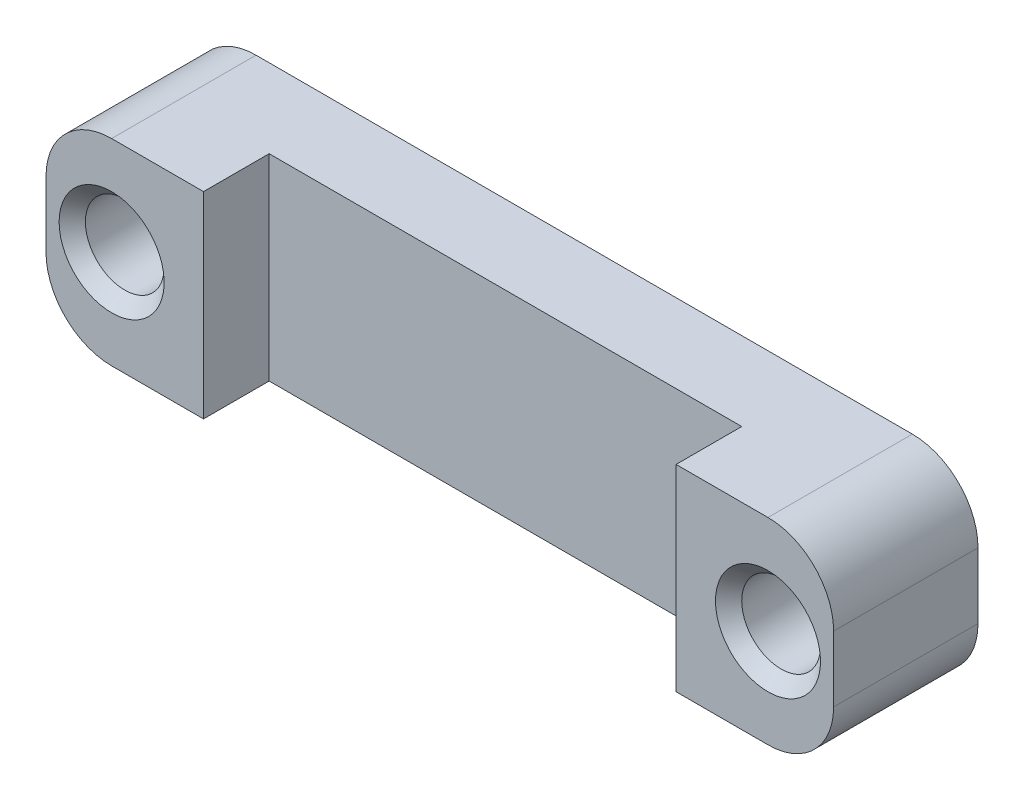
ISO-10303-21;
HEADER;
FILE_DESCRIPTION(('STEP AP214'),'2;1');
FILE_NAME('part.step','',(''),(''),'','','');
FILE_SCHEMA(('AUTOMOTIVE_DESIGN { 1 0 10303 214 1 1 1 1 }'));
ENDSEC;
DATA;
#1=APPLICATION_CONTEXT('core data for automotive mechanical design processes');
#2=APPLICATION_PROTOCOL_DEFINITION('international standard','automotive_design',2000,#1);
#3=PRODUCT_CONTEXT('',#1,'mechanical');
#4=PRODUCT('Part','Part','',(#3));
#5=PRODUCT_RELATED_PRODUCT_CATEGORY('part','',(#4));
#6=PRODUCT_DEFINITION_FORMATION('','',#4);
#7=PRODUCT_DEFINITION_CONTEXT('part definition',#1,'design');
#8=PRODUCT_DEFINITION('design','',#6,#7);
#9=PRODUCT_DEFINITION_SHAPE('','',#8);
#10=(LENGTH_UNIT() NAMED_UNIT(*) SI_UNIT(.MILLI.,.METRE.));
#11=(NAMED_UNIT(*) PLANE_ANGLE_UNIT() SI_UNIT($,.RADIAN.));
#12=(NAMED_UNIT(*) SI_UNIT($,.STERADIAN.) SOLID_ANGLE_UNIT());
#13=UNCERTAINTY_MEASURE_WITH_UNIT(LENGTH_MEASURE(1.E-05),#10,'distance_accuracy_value','');
#14=(GEOMETRIC_REPRESENTATION_CONTEXT(3) GLOBAL_UNCERTAINTY_ASSIGNED_CONTEXT((#13)) GLOBAL_UNIT_ASSIGNED_CONTEXT((#10,
#11,#12)) REPRESENTATION_CONTEXT('',''));
#15=CARTESIAN_POINT('',(0.,0.,0.));
#16=DIRECTION('',(0.,0.,1.));
#17=DIRECTION('',(1.,0.,0.));
#18=AXIS2_PLACEMENT_3D('',#15,#16,#17);
#19=CARTESIAN_POINT('',(0.,0.,11.));
#20=DIRECTION('',(0.,0.,-1.));
#21=DIRECTION('',(-1.,0.,0.));
#22=AXIS2_PLACEMENT_3D('',#19,#20,#21);
#23=PLANE('',#22);
#24=CARTESIAN_POINT('',(5.,7.5,11.));
#25=DIRECTION('',(0.,0.,-1.));
#26=DIRECTION('',(-1.,0.,0.));
#27=AXIS2_PLACEMENT_3D('',#24,#25,#26);
#28=CIRCLE('',#27,4.);
#29=CARTESIAN_POINT('',(1.,7.5,11.));
#30=VERTEX_POINT('',#29);
#31=EDGE_CURVE('E11',#30,#30,#28,.T.);
#32=ORIENTED_EDGE('',*,*,#31,.T.);
#33=EDGE_LOOP('',(#32));
#34=FACE_BOUND('',#33,.T.);
#35=DIRECTION('',(1.,0.,0.));
#36=VECTOR('',#35,1.);
#37=CARTESIAN_POINT('',(60.,0.,11.));
#38=LINE('',#37,#36);
#39=CARTESIAN_POINT('',(5.,0.,11.));
#40=VERTEX_POINT('',#39);
#41=CARTESIAN_POINT('',(12.,0.,11.));
#42=VERTEX_POINT('',#41);
#43=EDGE_CURVE('E163',#40,#42,#38,.T.);
#44=ORIENTED_EDGE('',*,*,#43,.T.);
#45=DIRECTION('',(0.,1.,0.));
#46=VECTOR('',#45,1.);
#47=CARTESIAN_POINT('',(12.,-6.00000000000001,11.));
#48=LINE('',#47,#46);
#49=CARTESIAN_POINT('',(12.,15.,11.));
#50=VERTEX_POINT('',#49);
#51=EDGE_CURVE('E146',#42,#50,#48,.T.);
#52=ORIENTED_EDGE('',*,*,#51,.T.);
#53=DIRECTION('',(-1.,0.,0.));
#54=VECTOR('',#53,1.);
#55=CARTESIAN_POINT('',(0.,15.,11.));
#56=LINE('',#55,#54);
#57=CARTESIAN_POINT('',(5.,15.,11.));
#58=VERTEX_POINT('',#57);
#59=EDGE_CURVE('E56',#50,#58,#56,.T.);
#60=ORIENTED_EDGE('',*,*,#59,.T.);
#61=CARTESIAN_POINT('',(5.,10.,11.));
#62=DIRECTION('',(0.,0.,-1.));
#63=DIRECTION('',(-1.,0.,0.));
#64=AXIS2_PLACEMENT_3D('',#61,#62,#63);
#65=CIRCLE('',#64,5.);
#66=CARTESIAN_POINT('',(0.,10.,11.));
#67=VERTEX_POINT('',#66);
#68=EDGE_CURVE('E205',#58,#67,#65,.F.);
#69=ORIENTED_EDGE('',*,*,#68,.T.);
#70=DIRECTION('',(0.,-1.,0.));
#71=VECTOR('',#70,1.);
#72=CARTESIAN_POINT('',(0.,0.,11.));
#73=LINE('',#72,#71);
#74=CARTESIAN_POINT('',(0.,5.,11.));
#75=VERTEX_POINT('',#74);
#76=EDGE_CURVE('E172',#67,#75,#73,.T.);
#77=ORIENTED_EDGE('',*,*,#76,.T.);
#78=CARTESIAN_POINT('',(5.,5.,11.));
#79=DIRECTION('',(0.,0.,-1.));
#80=DIRECTION('',(-1.,0.,0.));
#81=AXIS2_PLACEMENT_3D('',#78,#79,#80);
#82=CIRCLE('',#81,5.);
#83=EDGE_CURVE('E211',#75,#40,#82,.F.);
#84=ORIENTED_EDGE('',*,*,#83,.T.);
#85=EDGE_LOOP('',(#44,#52,#60,#69,#77,#84));
#86=FACE_BOUND('',#85,.T.);
#87=ADVANCED_FACE('F33',(#34,#86),#23,.F.);
#88=CARTESIAN_POINT('',(55.,7.5,11.));
#89=DIRECTION('',(0.,0.,-1.));
#90=DIRECTION('',(-1.,0.,0.));
#91=AXIS2_PLACEMENT_3D('',#88,#89,#90);
#92=CIRCLE('',#91,4.);
#93=CARTESIAN_POINT('',(51.,7.5,11.));
#94=VERTEX_POINT('',#93);
#95=EDGE_CURVE('E226',#94,#94,#92,.T.);
#96=ORIENTED_EDGE('',*,*,#95,.T.);
#97=EDGE_LOOP('',(#96));
#98=FACE_BOUND('',#97,.T.);
#99=CARTESIAN_POINT('',(55.,15.,11.));
#100=VERTEX_POINT('',#99);
#101=CARTESIAN_POINT('',(48.,15.,11.));
#102=VERTEX_POINT('',#101);
#103=EDGE_CURVE('E170',#100,#102,#56,.T.);
#104=ORIENTED_EDGE('',*,*,#103,.T.);
#105=DIRECTION('',(0.,1.,0.));
#106=VECTOR('',#105,1.);
#107=CARTESIAN_POINT('',(48.,-6.00000000000001,11.));
#108=LINE('',#107,#106);
#109=CARTESIAN_POINT('',(48.,0.,11.));
#110=VERTEX_POINT('',#109);
#111=EDGE_CURVE('E48',#110,#102,#108,.T.);
#112=ORIENTED_EDGE('',*,*,#111,.F.);
#113=CARTESIAN_POINT('',(55.,0.,11.));
#114=VERTEX_POINT('',#113);
#115=EDGE_CURVE('E167',#110,#114,#38,.T.);
#116=ORIENTED_EDGE('',*,*,#115,.T.);
#117=CARTESIAN_POINT('',(55.,5.,11.));
#118=DIRECTION('',(0.,0.,-1.));
#119=DIRECTION('',(-1.,0.,0.));
#120=AXIS2_PLACEMENT_3D('',#117,#118,#119);
#121=CIRCLE('',#120,5.);
#122=CARTESIAN_POINT('',(60.,5.,11.));
#123=VERTEX_POINT('',#122);
#124=EDGE_CURVE('E209',#114,#123,#121,.F.);
#125=ORIENTED_EDGE('',*,*,#124,.T.);
#126=DIRECTION('',(0.,1.,0.));
#127=VECTOR('',#126,1.);
#128=CARTESIAN_POINT('',(60.,15.,11.));
#129=LINE('',#128,#127);
#130=CARTESIAN_POINT('',(60.,10.,11.));
#131=VERTEX_POINT('',#130);
#132=EDGE_CURVE('E166',#123,#131,#129,.T.);
#133=ORIENTED_EDGE('',*,*,#132,.T.);
#134=CARTESIAN_POINT('',(55.,10.,11.));
#135=DIRECTION('',(0.,0.,-1.));
#136=DIRECTION('',(-1.,0.,0.));
#137=AXIS2_PLACEMENT_3D('',#134,#135,#136);
#138=CIRCLE('',#137,5.);
#139=EDGE_CURVE('E207',#131,#100,#138,.F.);
#140=ORIENTED_EDGE('',*,*,#139,.T.);
#141=EDGE_LOOP('',(#104,#112,#116,#125,#133,#140));
#142=FACE_BOUND('',#141,.T.);
#143=ADVANCED_FACE('F243',(#98,#142),#23,.F.);
#144=CARTESIAN_POINT('',(0.,0.,0.));
#145=DIRECTION('',(0.,0.,-1.));
#146=DIRECTION('',(-1.,0.,0.));
#147=AXIS2_PLACEMENT_3D('',#144,#145,#146);
#148=PLANE('',#147);
#149=CARTESIAN_POINT('',(5.,7.5,0.));
#150=DIRECTION('',(0.,0.,1.));
#151=DIRECTION('',(1.,0.,0.));
#152=AXIS2_PLACEMENT_3D('',#149,#150,#151);
#153=CIRCLE('',#152,3.);
#154=CARTESIAN_POINT('',(8.,7.5,0.));
#155=VERTEX_POINT('',#154);
#156=EDGE_CURVE('E159',#155,#155,#153,.T.);
#157=ORIENTED_EDGE('',*,*,#156,.T.);
#158=EDGE_LOOP('',(#157));
#159=FACE_BOUND('',#158,.T.);
#160=DIRECTION('',(1.,0.,0.));
#161=VECTOR('',#160,1.);
#162=CARTESIAN_POINT('',(60.,0.,0.));
#163=LINE('',#162,#161);
#164=CARTESIAN_POINT('',(5.,0.,0.));
#165=VERTEX_POINT('',#164);
#166=CARTESIAN_POINT('',(55.,0.,0.));
#167=VERTEX_POINT('',#166);
#168=EDGE_CURVE('E162',#165,#167,#163,.T.);
#169=ORIENTED_EDGE('',*,*,#168,.F.);
#170=CARTESIAN_POINT('',(5.,5.,0.));
#171=DIRECTION('',(0.,0.,-1.));
#172=DIRECTION('',(-1.,0.,0.));
#173=AXIS2_PLACEMENT_3D('',#170,#171,#172);
#174=CIRCLE('',#173,5.);
#175=CARTESIAN_POINT('',(0.,5.,0.));
#176=VERTEX_POINT('',#175);
#177=EDGE_CURVE('E198',#165,#176,#174,.T.);
#178=ORIENTED_EDGE('',*,*,#177,.T.);
#179=DIRECTION('',(0.,-1.,0.));
#180=VECTOR('',#179,1.);
#181=CARTESIAN_POINT('',(0.,0.,0.));
#182=LINE('',#181,#180);
#183=CARTESIAN_POINT('',(0.,10.,0.));
#184=VERTEX_POINT('',#183);
#185=EDGE_CURVE('E184',#184,#176,#182,.T.);
#186=ORIENTED_EDGE('',*,*,#185,.F.);
#187=CARTESIAN_POINT('',(5.,10.,0.));
#188=DIRECTION('',(0.,0.,-1.));
#189=DIRECTION('',(-1.,0.,0.));
#190=AXIS2_PLACEMENT_3D('',#187,#188,#189);
#191=CIRCLE('',#190,5.);
#192=CARTESIAN_POINT('',(5.,15.,0.));
#193=VERTEX_POINT('',#192);
#194=EDGE_CURVE('E192',#184,#193,#191,.T.);
#195=ORIENTED_EDGE('',*,*,#194,.T.);
#196=DIRECTION('',(-1.,0.,0.));
#197=VECTOR('',#196,1.);
#198=CARTESIAN_POINT('',(0.,15.,0.));
#199=LINE('',#198,#197);
#200=CARTESIAN_POINT('',(55.,15.,0.));
#201=VERTEX_POINT('',#200);
#202=EDGE_CURVE('E181',#201,#193,#199,.T.);
#203=ORIENTED_EDGE('',*,*,#202,.F.);
#204=CARTESIAN_POINT('',(55.,10.,0.));
#205=DIRECTION('',(0.,0.,-1.));
#206=DIRECTION('',(-1.,0.,0.));
#207=AXIS2_PLACEMENT_3D('',#204,#205,#206);
#208=CIRCLE('',#207,5.);
#209=CARTESIAN_POINT('',(60.,10.,0.));
#210=VERTEX_POINT('',#209);
#211=EDGE_CURVE('E194',#201,#210,#208,.T.);
#212=ORIENTED_EDGE('',*,*,#211,.T.);
#213=DIRECTION('',(0.,1.,0.));
#214=VECTOR('',#213,1.);
#215=CARTESIAN_POINT('',(60.,15.,0.));
#216=LINE('',#215,#214);
#217=CARTESIAN_POINT('',(60.,5.,0.));
#218=VERTEX_POINT('',#217);
#219=EDGE_CURVE('E178',#218,#210,#216,.T.);
#220=ORIENTED_EDGE('',*,*,#219,.F.);
#221=CARTESIAN_POINT('',(55.,5.,0.));
#222=DIRECTION('',(0.,0.,-1.));
#223=DIRECTION('',(-1.,0.,0.));
#224=AXIS2_PLACEMENT_3D('',#221,#222,#223);
#225=CIRCLE('',#224,5.);
#226=EDGE_CURVE('E196',#218,#167,#225,.T.);
#227=ORIENTED_EDGE('',*,*,#226,.T.);
#228=EDGE_LOOP('',(#169,#178,#186,#195,#203,#212,#220,#227));
#229=FACE_BOUND('',#228,.T.);
#230=CARTESIAN_POINT('',(55.,7.5,0.));
#231=DIRECTION('',(0.,0.,1.));
#232=DIRECTION('',(1.,0.,0.));
#233=AXIS2_PLACEMENT_3D('',#230,#231,#232);
#234=CIRCLE('',#233,2.99999999999999);
#235=CARTESIAN_POINT('',(58.,7.5,0.));
#236=VERTEX_POINT('',#235);
#237=EDGE_CURVE('E156',#236,#236,#234,.T.);
#238=ORIENTED_EDGE('',*,*,#237,.T.);
#239=EDGE_LOOP('',(#238));
#240=FACE_BOUND('',#239,.T.);
#241=ADVANCED_FACE('F249',(#159,#229,#240),#148,.T.);
#242=CARTESIAN_POINT('',(60.,0.,11.));
#243=DIRECTION('',(0.,1.,0.));
#244=DIRECTION('',(-1.,0.,0.));
#245=AXIS2_PLACEMENT_3D('',#242,#243,#244);
#246=PLANE('',#245);
#247=DIRECTION('',(-1.,0.,0.));
#248=VECTOR('',#247,1.);
#249=CARTESIAN_POINT('',(60.,0.,6.));
#250=LINE('',#249,#248);
#251=CARTESIAN_POINT('',(48.,0.,6.));
#252=VERTEX_POINT('',#251);
#253=CARTESIAN_POINT('',(12.,0.,6.00000000000001));
#254=VERTEX_POINT('',#253);
#255=EDGE_CURVE('E131',#252,#254,#250,.T.);
#256=ORIENTED_EDGE('',*,*,#255,.T.);
#257=DIRECTION('',(0.,0.,1.));
#258=VECTOR('',#257,1.);
#259=CARTESIAN_POINT('',(12.,0.,11.));
#260=LINE('',#259,#258);
#261=EDGE_CURVE('E153',#254,#42,#260,.T.);
#262=ORIENTED_EDGE('',*,*,#261,.T.);
#263=ORIENTED_EDGE('',*,*,#43,.F.);
#264=DIRECTION('',(0.,0.,-1.));
#265=VECTOR('',#264,1.);
#266=CARTESIAN_POINT('',(5.,0.,11.));
#267=LINE('',#266,#265);
#268=EDGE_CURVE('E189',#40,#165,#267,.T.);
#269=ORIENTED_EDGE('',*,*,#268,.T.);
#270=ORIENTED_EDGE('',*,*,#168,.T.);
#271=DIRECTION('',(0.,0.,-1.));
#272=VECTOR('',#271,1.);
#273=CARTESIAN_POINT('',(55.,0.,11.));
#274=LINE('',#273,#272);
#275=EDGE_CURVE('E175',#167,#114,#274,.F.);
#276=ORIENTED_EDGE('',*,*,#275,.T.);
#277=ORIENTED_EDGE('',*,*,#115,.F.);
#278=DIRECTION('',(0.,0.,-1.));
#279=VECTOR('',#278,1.);
#280=CARTESIAN_POINT('',(48.,0.,11.));
#281=LINE('',#280,#279);
#282=EDGE_CURVE('E148',#110,#252,#281,.T.);
#283=ORIENTED_EDGE('',*,*,#282,.T.);
#284=EDGE_LOOP('',(#256,#262,#263,#269,#270,#276,#277,#283));
#285=FACE_BOUND('',#284,.T.);
#286=ADVANCED_FACE('F256',(#285),#246,.F.);
#287=CARTESIAN_POINT('',(60.,15.,11.));
#288=DIRECTION('',(-1.,0.,0.));
#289=DIRECTION('',(0.,0.,1.));
#290=AXIS2_PLACEMENT_3D('',#287,#288,#289);
#291=PLANE('',#290);
#292=ORIENTED_EDGE('',*,*,#132,.F.);
#293=DIRECTION('',(0.,0.,-1.));
#294=VECTOR('',#293,1.);
#295=CARTESIAN_POINT('',(60.,5.,11.));
#296=LINE('',#295,#294);
#297=EDGE_CURVE('E215',#123,#218,#296,.T.);
#298=ORIENTED_EDGE('',*,*,#297,.T.);
#299=ORIENTED_EDGE('',*,*,#219,.T.);
#300=DIRECTION('',(0.,0.,-1.));
#301=VECTOR('',#300,1.);
#302=CARTESIAN_POINT('',(60.,10.,11.));
#303=LINE('',#302,#301);
#304=EDGE_CURVE('E213',#210,#131,#303,.F.);
#305=ORIENTED_EDGE('',*,*,#304,.T.);
#306=EDGE_LOOP('',(#292,#298,#299,#305));
#307=FACE_BOUND('',#306,.T.);
#308=ADVANCED_FACE('F264',(#307),#291,.F.);
#309=CARTESIAN_POINT('',(0.,15.,11.));
#310=DIRECTION('',(0.,-1.,0.));
#311=DIRECTION('',(0.,0.,-1.));
#312=AXIS2_PLACEMENT_3D('',#309,#310,#311);
#313=PLANE('',#312);
#314=ORIENTED_EDGE('',*,*,#59,.F.);
#315=DIRECTION('',(0.,0.,1.));
#316=VECTOR('',#315,1.);
#317=CARTESIAN_POINT('',(12.,15.,6.00000000000001));
#318=LINE('',#317,#316);
#319=CARTESIAN_POINT('',(12.,15.,6.00000000000001));
#320=VERTEX_POINT('',#319);
#321=EDGE_CURVE('E142',#320,#50,#318,.T.);
#322=ORIENTED_EDGE('',*,*,#321,.F.);
#323=DIRECTION('',(-1.,0.,0.));
#324=VECTOR('',#323,1.);
#325=CARTESIAN_POINT('',(48.,15.,6.));
#326=LINE('',#325,#324);
#327=CARTESIAN_POINT('',(48.,15.,6.));
#328=VERTEX_POINT('',#327);
#329=EDGE_CURVE('E128',#328,#320,#326,.T.);
#330=ORIENTED_EDGE('',*,*,#329,.F.);
#331=DIRECTION('',(0.,0.,-1.));
#332=VECTOR('',#331,1.);
#333=CARTESIAN_POINT('',(48.,15.,11.));
#334=LINE('',#333,#332);
#335=EDGE_CURVE('E135',#102,#328,#334,.T.);
#336=ORIENTED_EDGE('',*,*,#335,.F.);
#337=ORIENTED_EDGE('',*,*,#103,.F.);
#338=DIRECTION('',(0.,0.,-1.));
#339=VECTOR('',#338,1.);
#340=CARTESIAN_POINT('',(55.,15.,11.));
#341=LINE('',#340,#339);
#342=EDGE_CURVE('E220',#100,#201,#341,.T.);
#343=ORIENTED_EDGE('',*,*,#342,.T.);
#344=ORIENTED_EDGE('',*,*,#202,.T.);
#345=DIRECTION('',(0.,0.,-1.));
#346=VECTOR('',#345,1.);
#347=CARTESIAN_POINT('',(5.,15.,11.));
#348=LINE('',#347,#346);
#349=EDGE_CURVE('E218',#193,#58,#348,.F.);
#350=ORIENTED_EDGE('',*,*,#349,.T.);
#351=EDGE_LOOP('',(#314,#322,#330,#336,#337,#343,#344,#350));
#352=FACE_BOUND('',#351,.T.);
#353=ADVANCED_FACE('F141',(#352),#313,.F.);
#354=CARTESIAN_POINT('',(0.,0.,11.));
#355=DIRECTION('',(1.,0.,0.));
#356=DIRECTION('',(0.,0.,-1.));
#357=AXIS2_PLACEMENT_3D('',#354,#355,#356);
#358=PLANE('',#357);
#359=ORIENTED_EDGE('',*,*,#185,.T.);
#360=DIRECTION('',(0.,0.,-1.));
#361=VECTOR('',#360,1.);
#362=CARTESIAN_POINT('',(0.,5.,11.));
#363=LINE('',#362,#361);
#364=EDGE_CURVE('E203',#176,#75,#363,.F.);
#365=ORIENTED_EDGE('',*,*,#364,.T.);
#366=ORIENTED_EDGE('',*,*,#76,.F.);
#367=DIRECTION('',(0.,0.,-1.));
#368=VECTOR('',#367,1.);
#369=CARTESIAN_POINT('',(0.,10.,11.));
#370=LINE('',#369,#368);
#371=EDGE_CURVE('E200',#67,#184,#370,.T.);
#372=ORIENTED_EDGE('',*,*,#371,.T.);
#373=EDGE_LOOP('',(#359,#365,#366,#372));
#374=FACE_BOUND('',#373,.T.);
#375=ADVANCED_FACE('F258',(#374),#358,.F.);
#376=CARTESIAN_POINT('',(5.,7.5,11.));
#377=DIRECTION('',(0.,0.,-1.));
#378=DIRECTION('',(-1.,0.,0.));
#379=AXIS2_PLACEMENT_3D('',#376,#377,#378);
#380=CYLINDRICAL_SURFACE('',#379,3.);
#381=CARTESIAN_POINT('',(5.,7.5,10.));
#382=DIRECTION('',(0.,0.,-1.));
#383=DIRECTION('',(-1.,0.,0.));
#384=AXIS2_PLACEMENT_3D('',#381,#382,#383);
#385=CIRCLE('',#384,3.);
#386=CARTESIAN_POINT('',(2.,7.5,10.));
#387=VERTEX_POINT('',#386);
#388=EDGE_CURVE('E41',#387,#387,#385,.F.);
#389=ORIENTED_EDGE('',*,*,#388,.T.);
#390=EDGE_LOOP('',(#389));
#391=FACE_BOUND('',#390,.T.);
#392=ORIENTED_EDGE('',*,*,#156,.F.);
#393=EDGE_LOOP('',(#392));
#394=FACE_BOUND('',#393,.T.);
#395=ADVANCED_FACE('F231',(#391,#394),#380,.F.);
#396=CARTESIAN_POINT('',(55.,7.5,11.));
#397=DIRECTION('',(0.,0.,-1.));
#398=DIRECTION('',(-1.,0.,0.));
#399=AXIS2_PLACEMENT_3D('',#396,#397,#398);
#400=CYLINDRICAL_SURFACE('',#399,2.99999999999999);
#401=CARTESIAN_POINT('',(55.,7.5,9.99999999999999));
#402=DIRECTION('',(0.,0.,-1.));
#403=DIRECTION('',(-1.,0.,0.));
#404=AXIS2_PLACEMENT_3D('',#401,#402,#403);
#405=CIRCLE('',#404,2.99999999999999);
#406=CARTESIAN_POINT('',(52.,7.5,9.99999999999999));
#407=VERTEX_POINT('',#406);
#408=EDGE_CURVE('E223',#407,#407,#405,.F.);
#409=ORIENTED_EDGE('',*,*,#408,.T.);
#410=EDGE_LOOP('',(#409));
#411=FACE_BOUND('',#410,.T.);
#412=ORIENTED_EDGE('',*,*,#237,.F.);
#413=EDGE_LOOP('',(#412));
#414=FACE_BOUND('',#413,.T.);
#415=ADVANCED_FACE('F275',(#411,#414),#400,.F.);
#416=CARTESIAN_POINT('',(5.,5.,11.));
#417=DIRECTION('',(0.,0.,-1.));
#418=DIRECTION('',(-1.,0.,0.));
#419=AXIS2_PLACEMENT_3D('',#416,#417,#418);
#420=CYLINDRICAL_SURFACE('',#419,5.);
#421=ORIENTED_EDGE('',*,*,#83,.F.);
#422=ORIENTED_EDGE('',*,*,#364,.F.);
#423=ORIENTED_EDGE('',*,*,#177,.F.);
#424=ORIENTED_EDGE('',*,*,#268,.F.);
#425=EDGE_LOOP('',(#421,#422,#423,#424));
#426=FACE_BOUND('',#425,.T.);
#427=ADVANCED_FACE('F271',(#426),#420,.T.);
#428=CARTESIAN_POINT('',(55.,5.,11.));
#429=DIRECTION('',(0.,0.,-1.));
#430=DIRECTION('',(-1.,0.,0.));
#431=AXIS2_PLACEMENT_3D('',#428,#429,#430);
#432=CYLINDRICAL_SURFACE('',#431,5.);
#433=ORIENTED_EDGE('',*,*,#124,.F.);
#434=ORIENTED_EDGE('',*,*,#275,.F.);
#435=ORIENTED_EDGE('',*,*,#226,.F.);
#436=ORIENTED_EDGE('',*,*,#297,.F.);
#437=EDGE_LOOP('',(#433,#434,#435,#436));
#438=FACE_BOUND('',#437,.T.);
#439=ADVANCED_FACE('F274',(#438),#432,.T.);
#440=CARTESIAN_POINT('',(55.,10.,11.));
#441=DIRECTION('',(0.,0.,-1.));
#442=DIRECTION('',(-1.,0.,0.));
#443=AXIS2_PLACEMENT_3D('',#440,#441,#442);
#444=CYLINDRICAL_SURFACE('',#443,5.);
#445=ORIENTED_EDGE('',*,*,#139,.F.);
#446=ORIENTED_EDGE('',*,*,#304,.F.);
#447=ORIENTED_EDGE('',*,*,#211,.F.);
#448=ORIENTED_EDGE('',*,*,#342,.F.);
#449=EDGE_LOOP('',(#445,#446,#447,#448));
#450=FACE_BOUND('',#449,.T.);
#451=ADVANCED_FACE('F279',(#450),#444,.T.);
#452=CARTESIAN_POINT('',(5.,10.,11.));
#453=DIRECTION('',(0.,0.,-1.));
#454=DIRECTION('',(-1.,0.,0.));
#455=AXIS2_PLACEMENT_3D('',#452,#453,#454);
#456=CYLINDRICAL_SURFACE('',#455,5.);
#457=ORIENTED_EDGE('',*,*,#68,.F.);
#458=ORIENTED_EDGE('',*,*,#349,.F.);
#459=ORIENTED_EDGE('',*,*,#194,.F.);
#460=ORIENTED_EDGE('',*,*,#371,.F.);
#461=EDGE_LOOP('',(#457,#458,#459,#460));
#462=FACE_BOUND('',#461,.T.);
#463=ADVANCED_FACE('F283',(#462),#456,.T.);
#464=CARTESIAN_POINT('',(12.,-6.00000000000001,6.00000000000001));
#465=DIRECTION('',(-1.,0.,0.));
#466=DIRECTION('',(0.,0.,1.));
#467=AXIS2_PLACEMENT_3D('',#464,#465,#466);
#468=PLANE('',#467);
#469=DIRECTION('',(0.,1.,0.));
#470=VECTOR('',#469,1.);
#471=CARTESIAN_POINT('',(12.,-6.00000000000001,6.00000000000001));
#472=LINE('',#471,#470);
#473=EDGE_CURVE('E133',#254,#320,#472,.T.);
#474=ORIENTED_EDGE('',*,*,#473,.T.);
#475=ORIENTED_EDGE('',*,*,#321,.T.);
#476=ORIENTED_EDGE('',*,*,#51,.F.);
#477=ORIENTED_EDGE('',*,*,#261,.F.);
#478=EDGE_LOOP('',(#474,#475,#476,#477));
#479=FACE_BOUND('',#478,.T.);
#480=ADVANCED_FACE('F286',(#479),#468,.F.);
#481=CARTESIAN_POINT('',(48.,-6.00000000000001,6.));
#482=DIRECTION('',(0.,0.,-1.));
#483=DIRECTION('',(-1.,0.,0.));
#484=AXIS2_PLACEMENT_3D('',#481,#482,#483);
#485=PLANE('',#484);
#486=DIRECTION('',(0.,1.,0.));
#487=VECTOR('',#486,1.);
#488=CARTESIAN_POINT('',(48.,-6.00000000000001,6.));
#489=LINE('',#488,#487);
#490=EDGE_CURVE('E124',#252,#328,#489,.T.);
#491=ORIENTED_EDGE('',*,*,#490,.T.);
#492=ORIENTED_EDGE('',*,*,#329,.T.);
#493=ORIENTED_EDGE('',*,*,#473,.F.);
#494=ORIENTED_EDGE('',*,*,#255,.F.);
#495=EDGE_LOOP('',(#491,#492,#493,#494));
#496=FACE_BOUND('',#495,.T.);
#497=ADVANCED_FACE('F125',(#496),#485,.F.);
#498=CARTESIAN_POINT('',(48.,-6.00000000000001,11.));
#499=DIRECTION('',(1.,0.,0.));
#500=DIRECTION('',(0.,0.,-1.));
#501=AXIS2_PLACEMENT_3D('',#498,#499,#500);
#502=PLANE('',#501);
#503=ORIENTED_EDGE('',*,*,#111,.T.);
#504=ORIENTED_EDGE('',*,*,#335,.T.);
#505=ORIENTED_EDGE('',*,*,#490,.F.);
#506=ORIENTED_EDGE('',*,*,#282,.F.);
#507=EDGE_LOOP('',(#503,#504,#505,#506));
#508=FACE_BOUND('',#507,.T.);
#509=ADVANCED_FACE('F136',(#508),#502,.F.);
#510=CARTESIAN_POINT('',(55.,7.5,9.99999999999999));
#511=DIRECTION('',(0.,0.,1.));
#512=DIRECTION('',(1.,0.,0.));
#513=AXIS2_PLACEMENT_3D('',#510,#511,#512);
#514=CONICAL_SURFACE('',#513,2.99999999999999,0.78539816339745);
#515=ORIENTED_EDGE('',*,*,#95,.F.);
#516=EDGE_LOOP('',(#515));
#517=FACE_BOUND('',#516,.T.);
#518=ORIENTED_EDGE('',*,*,#408,.F.);
#519=EDGE_LOOP('',(#518));
#520=FACE_BOUND('',#519,.T.);
#521=ADVANCED_FACE('F235',(#517,#520),#514,.F.);
#522=CARTESIAN_POINT('',(5.,7.5,10.));
#523=DIRECTION('',(0.,0.,1.));
#524=DIRECTION('',(1.,0.,0.));
#525=AXIS2_PLACEMENT_3D('',#522,#523,#524);
#526=CONICAL_SURFACE('',#525,3.,0.785398163397453);
#527=ORIENTED_EDGE('',*,*,#31,.F.);
#528=EDGE_LOOP('',(#527));
#529=FACE_BOUND('',#528,.T.);
#530=ORIENTED_EDGE('',*,*,#388,.F.);
#531=EDGE_LOOP('',(#530));
#532=FACE_BOUND('',#531,.T.);
#533=ADVANCED_FACE('F35',(#529,#532),#526,.F.);
#534=CLOSED_SHELL('',(#87,#143,#241,#286,#308,#353,#375,#395,#415,#427,#439,#451,#463,#480,#497,
#509,#521,#533));
#535=MANIFOLD_SOLID_BREP('B2',#534);
#536=ADVANCED_BREP_SHAPE_REPRESENTATION('',(#18,#535),#14);
#537=SHAPE_DEFINITION_REPRESENTATION(#9,#536);
ENDSEC;
END-ISO-10303-21;
